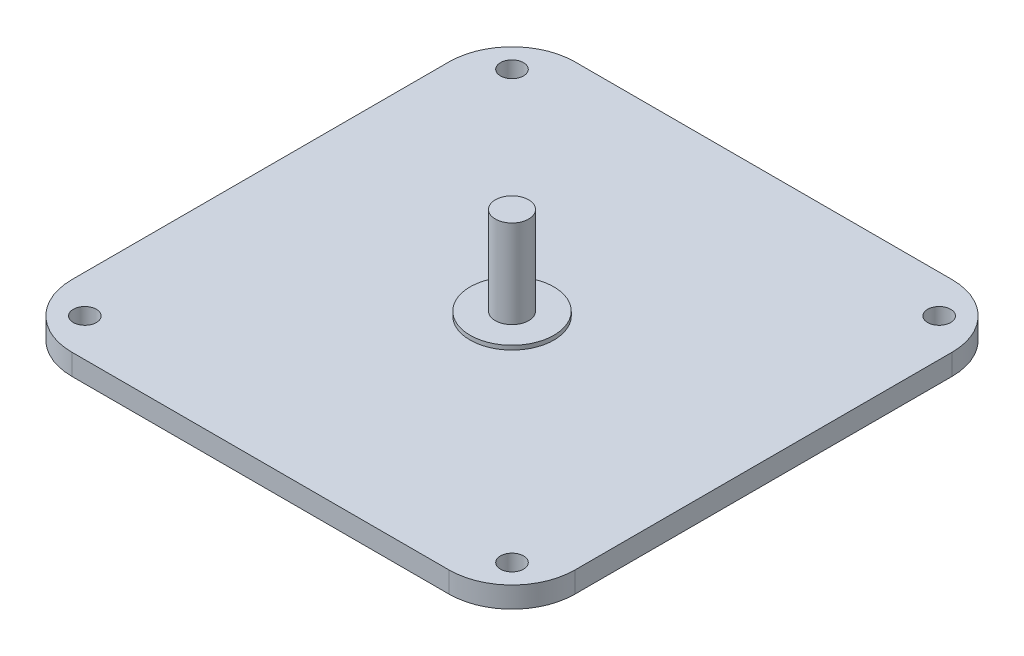
ISO-10303-21;
HEADER;
FILE_DESCRIPTION(('STEP AP214'),'2;1');
FILE_NAME('part.step','',(''),(''),'','','');
FILE_SCHEMA(('AUTOMOTIVE_DESIGN { 1 0 10303 214 1 1 1 1 }'));
ENDSEC;
DATA;
#1=APPLICATION_CONTEXT('core data for automotive mechanical design processes');
#2=APPLICATION_PROTOCOL_DEFINITION('international standard','automotive_design',2000,#1);
#3=PRODUCT_CONTEXT('',#1,'mechanical');
#4=PRODUCT('Part','Part','',(#3));
#5=PRODUCT_RELATED_PRODUCT_CATEGORY('part','',(#4));
#6=PRODUCT_DEFINITION_FORMATION('','',#4);
#7=PRODUCT_DEFINITION_CONTEXT('part definition',#1,'design');
#8=PRODUCT_DEFINITION('design','',#6,#7);
#9=PRODUCT_DEFINITION_SHAPE('','',#8);
#10=(LENGTH_UNIT() NAMED_UNIT(*) SI_UNIT(.MILLI.,.METRE.));
#11=(NAMED_UNIT(*) PLANE_ANGLE_UNIT() SI_UNIT($,.RADIAN.));
#12=(NAMED_UNIT(*) SI_UNIT($,.STERADIAN.) SOLID_ANGLE_UNIT());
#13=UNCERTAINTY_MEASURE_WITH_UNIT(LENGTH_MEASURE(1.E-05),#10,'distance_accuracy_value','');
#14=(GEOMETRIC_REPRESENTATION_CONTEXT(3) GLOBAL_UNCERTAINTY_ASSIGNED_CONTEXT((#13)) GLOBAL_UNIT_ASSIGNED_CONTEXT((#10,
#11,#12)) REPRESENTATION_CONTEXT('',''));
#15=CARTESIAN_POINT('',(0.,0.,0.));
#16=DIRECTION('',(0.,0.,1.));
#17=DIRECTION('',(1.,0.,0.));
#18=AXIS2_PLACEMENT_3D('',#15,#16,#17);
#19=CARTESIAN_POINT('',(0.,2.5,60.));
#20=DIRECTION('',(0.,0.,-1.));
#21=DIRECTION('',(-1.,0.,0.));
#22=AXIS2_PLACEMENT_3D('',#19,#20,#21);
#23=PLANE('',#22);
#24=DIRECTION('',(1.,0.,0.));
#25=VECTOR('',#24,1.);
#26=CARTESIAN_POINT('',(0.,-2.5,60.));
#27=LINE('',#26,#25);
#28=CARTESIAN_POINT('',(-45.,-2.5,60.));
#29=VERTEX_POINT('',#28);
#30=CARTESIAN_POINT('',(45.,-2.5,60.));
#31=VERTEX_POINT('',#30);
#32=EDGE_CURVE('E115',#29,#31,#27,.T.);
#33=ORIENTED_EDGE('',*,*,#32,.T.);
#34=DIRECTION('',(0.,-1.,0.));
#35=VECTOR('',#34,1.);
#36=CARTESIAN_POINT('',(45.,2.5,60.));
#37=LINE('',#36,#35);
#38=CARTESIAN_POINT('',(45.,2.5,60.));
#39=VERTEX_POINT('',#38);
#40=EDGE_CURVE('E11',#31,#39,#37,.F.);
#41=ORIENTED_EDGE('',*,*,#40,.T.);
#42=DIRECTION('',(1.,0.,0.));
#43=VECTOR('',#42,1.);
#44=CARTESIAN_POINT('',(0.,2.5,60.));
#45=LINE('',#44,#43);
#46=CARTESIAN_POINT('',(-45.,2.5,60.));
#47=VERTEX_POINT('',#46);
#48=EDGE_CURVE('E162',#47,#39,#45,.T.);
#49=ORIENTED_EDGE('',*,*,#48,.F.);
#50=DIRECTION('',(0.,-1.,0.));
#51=VECTOR('',#50,1.);
#52=CARTESIAN_POINT('',(-45.,-2.5,60.));
#53=LINE('',#52,#51);
#54=EDGE_CURVE('E47',#47,#29,#53,.T.);
#55=ORIENTED_EDGE('',*,*,#54,.T.);
#56=EDGE_LOOP('',(#33,#41,#49,#55));
#57=FACE_BOUND('',#56,.T.);
#58=ADVANCED_FACE('F37',(#57),#23,.F.);
#59=CARTESIAN_POINT('',(60.,2.5,0.));
#60=DIRECTION('',(-1.,0.,0.));
#61=DIRECTION('',(0.,0.,1.));
#62=AXIS2_PLACEMENT_3D('',#59,#60,#61);
#63=PLANE('',#62);
#64=DIRECTION('',(0.,0.,-1.));
#65=VECTOR('',#64,1.);
#66=CARTESIAN_POINT('',(60.,-2.5,0.));
#67=LINE('',#66,#65);
#68=CARTESIAN_POINT('',(60.,-2.5,45.));
#69=VERTEX_POINT('',#68);
#70=CARTESIAN_POINT('',(60.,-2.5,-45.));
#71=VERTEX_POINT('',#70);
#72=EDGE_CURVE('E189',#69,#71,#67,.T.);
#73=ORIENTED_EDGE('',*,*,#72,.T.);
#74=DIRECTION('',(0.,-1.,0.));
#75=VECTOR('',#74,1.);
#76=CARTESIAN_POINT('',(60.,2.5,-45.));
#77=LINE('',#76,#75);
#78=CARTESIAN_POINT('',(60.,2.5,-45.));
#79=VERTEX_POINT('',#78);
#80=EDGE_CURVE('E57',#71,#79,#77,.F.);
#81=ORIENTED_EDGE('',*,*,#80,.T.);
#82=DIRECTION('',(0.,0.,-1.));
#83=VECTOR('',#82,1.);
#84=CARTESIAN_POINT('',(60.,2.5,0.));
#85=LINE('',#84,#83);
#86=CARTESIAN_POINT('',(60.,2.5,45.));
#87=VERTEX_POINT('',#86);
#88=EDGE_CURVE('E161',#87,#79,#85,.T.);
#89=ORIENTED_EDGE('',*,*,#88,.F.);
#90=DIRECTION('',(0.,-1.,0.));
#91=VECTOR('',#90,1.);
#92=CARTESIAN_POINT('',(60.,2.5,45.));
#93=LINE('',#92,#91);
#94=EDGE_CURVE('E151',#87,#69,#93,.T.);
#95=ORIENTED_EDGE('',*,*,#94,.T.);
#96=EDGE_LOOP('',(#73,#81,#89,#95));
#97=FACE_BOUND('',#96,.T.);
#98=ADVANCED_FACE('F211',(#97),#63,.F.);
#99=CARTESIAN_POINT('',(0.,2.5,-60.));
#100=DIRECTION('',(0.,0.,-1.));
#101=DIRECTION('',(-1.,0.,0.));
#102=AXIS2_PLACEMENT_3D('',#99,#100,#101);
#103=PLANE('',#102);
#104=DIRECTION('',(1.,0.,0.));
#105=VECTOR('',#104,1.);
#106=CARTESIAN_POINT('',(0.,-2.5,-60.));
#107=LINE('',#106,#105);
#108=CARTESIAN_POINT('',(-45.,-2.5,-60.));
#109=VERTEX_POINT('',#108);
#110=CARTESIAN_POINT('',(45.,-2.5,-60.));
#111=VERTEX_POINT('',#110);
#112=EDGE_CURVE('E129',#109,#111,#107,.T.);
#113=ORIENTED_EDGE('',*,*,#112,.F.);
#114=DIRECTION('',(0.,-1.,0.));
#115=VECTOR('',#114,1.);
#116=CARTESIAN_POINT('',(-45.,2.5,-60.));
#117=LINE('',#116,#115);
#118=CARTESIAN_POINT('',(-45.,2.5,-60.));
#119=VERTEX_POINT('',#118);
#120=EDGE_CURVE('E150',#109,#119,#117,.F.);
#121=ORIENTED_EDGE('',*,*,#120,.T.);
#122=DIRECTION('',(1.,0.,0.));
#123=VECTOR('',#122,1.);
#124=CARTESIAN_POINT('',(0.,2.5,-60.));
#125=LINE('',#124,#123);
#126=CARTESIAN_POINT('',(45.,2.5,-60.));
#127=VERTEX_POINT('',#126);
#128=EDGE_CURVE('E131',#119,#127,#125,.T.);
#129=ORIENTED_EDGE('',*,*,#128,.T.);
#130=DIRECTION('',(0.,-1.,0.));
#131=VECTOR('',#130,1.);
#132=CARTESIAN_POINT('',(45.,-2.5,-60.));
#133=LINE('',#132,#131);
#134=EDGE_CURVE('E144',#127,#111,#133,.T.);
#135=ORIENTED_EDGE('',*,*,#134,.T.);
#136=EDGE_LOOP('',(#113,#121,#129,#135));
#137=FACE_BOUND('',#136,.T.);
#138=ADVANCED_FACE('F191',(#137),#103,.T.);
#139=CARTESIAN_POINT('',(50.9553953974915,2.5,50.9553953974922));
#140=DIRECTION('',(0.,-1.,0.));
#141=DIRECTION('',(0.,0.,-1.));
#142=AXIS2_PLACEMENT_3D('',#139,#140,#141);
#143=CYLINDRICAL_SURFACE('',#142,2.75);
#144=CARTESIAN_POINT('',(50.9553953974915,2.5,50.9553953974922));
#145=DIRECTION('',(0.,1.,0.));
#146=DIRECTION('',(0.,0.,1.));
#147=AXIS2_PLACEMENT_3D('',#144,#145,#146);
#148=CIRCLE('',#147,2.75);
#149=CARTESIAN_POINT('',(50.9553953974915,2.5,53.7053953974923));
#150=VERTEX_POINT('',#149);
#151=EDGE_CURVE('E165',#150,#150,#148,.T.);
#152=ORIENTED_EDGE('',*,*,#151,.T.);
#153=EDGE_LOOP('',(#152));
#154=FACE_BOUND('',#153,.T.);
#155=CARTESIAN_POINT('',(50.9553953974915,-2.5,50.9553953974922));
#156=DIRECTION('',(0.,1.,0.));
#157=DIRECTION('',(0.,0.,1.));
#158=AXIS2_PLACEMENT_3D('',#155,#156,#157);
#159=CIRCLE('',#158,2.75);
#160=CARTESIAN_POINT('',(50.9553953974915,-2.5,53.7053953974923));
#161=VERTEX_POINT('',#160);
#162=EDGE_CURVE('E183',#161,#161,#159,.T.);
#163=ORIENTED_EDGE('',*,*,#162,.F.);
#164=EDGE_LOOP('',(#163));
#165=FACE_BOUND('',#164,.T.);
#166=ADVANCED_FACE('F224',(#154,#165),#143,.F.);
#167=CARTESIAN_POINT('',(50.9553953974921,2.5,-50.9553953974917));
#168=DIRECTION('',(0.,-1.,0.));
#169=DIRECTION('',(0.,0.,-1.));
#170=AXIS2_PLACEMENT_3D('',#167,#168,#169);
#171=CYLINDRICAL_SURFACE('',#170,2.75);
#172=CARTESIAN_POINT('',(50.9553953974921,2.5,-50.9553953974917));
#173=DIRECTION('',(0.,1.,0.));
#174=DIRECTION('',(0.,0.,1.));
#175=AXIS2_PLACEMENT_3D('',#172,#173,#174);
#176=CIRCLE('',#175,2.75);
#177=CARTESIAN_POINT('',(50.9553953974921,2.5,-48.2053953974917));
#178=VERTEX_POINT('',#177);
#179=EDGE_CURVE('E166',#178,#178,#176,.T.);
#180=ORIENTED_EDGE('',*,*,#179,.T.);
#181=EDGE_LOOP('',(#180));
#182=FACE_BOUND('',#181,.T.);
#183=CARTESIAN_POINT('',(50.9553953974921,-2.5,-50.9553953974917));
#184=DIRECTION('',(0.,1.,0.));
#185=DIRECTION('',(0.,0.,1.));
#186=AXIS2_PLACEMENT_3D('',#183,#184,#185);
#187=CIRCLE('',#186,2.75);
#188=CARTESIAN_POINT('',(50.9553953974921,-2.5,-48.2053953974917));
#189=VERTEX_POINT('',#188);
#190=EDGE_CURVE('E181',#189,#189,#187,.T.);
#191=ORIENTED_EDGE('',*,*,#190,.F.);
#192=EDGE_LOOP('',(#191));
#193=FACE_BOUND('',#192,.T.);
#194=ADVANCED_FACE('F228',(#182,#193),#171,.F.);
#195=CARTESIAN_POINT('',(-50.9553953974919,2.5,-50.9553953974919));
#196=DIRECTION('',(0.,-1.,0.));
#197=DIRECTION('',(0.,0.,-1.));
#198=AXIS2_PLACEMENT_3D('',#195,#196,#197);
#199=CYLINDRICAL_SURFACE('',#198,2.75);
#200=CARTESIAN_POINT('',(-50.9553953974919,2.5,-50.9553953974919));
#201=DIRECTION('',(0.,1.,0.));
#202=DIRECTION('',(0.,0.,1.));
#203=AXIS2_PLACEMENT_3D('',#200,#201,#202);
#204=CIRCLE('',#203,2.75);
#205=CARTESIAN_POINT('',(-50.9553953974919,2.5,-48.2053953974919));
#206=VERTEX_POINT('',#205);
#207=EDGE_CURVE('E368',#206,#206,#204,.T.);
#208=ORIENTED_EDGE('',*,*,#207,.T.);
#209=EDGE_LOOP('',(#208));
#210=FACE_BOUND('',#209,.T.);
#211=CARTESIAN_POINT('',(-50.9553953974919,-2.5,-50.9553953974919));
#212=DIRECTION('',(0.,1.,0.));
#213=DIRECTION('',(0.,0.,1.));
#214=AXIS2_PLACEMENT_3D('',#211,#212,#213);
#215=CIRCLE('',#214,2.75);
#216=CARTESIAN_POINT('',(-50.9553953974919,-2.5,-48.2053953974919));
#217=VERTEX_POINT('',#216);
#218=EDGE_CURVE('E180',#217,#217,#215,.T.);
#219=ORIENTED_EDGE('',*,*,#218,.F.);
#220=EDGE_LOOP('',(#219));
#221=FACE_BOUND('',#220,.T.);
#222=ADVANCED_FACE('F229',(#210,#221),#199,.F.);
#223=CARTESIAN_POINT('',(-50.9553953974924,2.5,50.9553953974913));
#224=DIRECTION('',(0.,-1.,0.));
#225=DIRECTION('',(0.,0.,-1.));
#226=AXIS2_PLACEMENT_3D('',#223,#224,#225);
#227=CYLINDRICAL_SURFACE('',#226,2.75000000000001);
#228=CARTESIAN_POINT('',(-50.9553953974924,2.5,50.9553953974913));
#229=DIRECTION('',(0.,1.,0.));
#230=DIRECTION('',(0.,0.,1.));
#231=AXIS2_PLACEMENT_3D('',#228,#229,#230);
#232=CIRCLE('',#231,2.75000000000001);
#233=CARTESIAN_POINT('',(-50.9553953974924,2.5,53.7053953974914));
#234=VERTEX_POINT('',#233);
#235=EDGE_CURVE('E130',#234,#234,#232,.T.);
#236=ORIENTED_EDGE('',*,*,#235,.T.);
#237=EDGE_LOOP('',(#236));
#238=FACE_BOUND('',#237,.T.);
#239=CARTESIAN_POINT('',(-50.9553953974924,-2.5,50.9553953974913));
#240=DIRECTION('',(0.,1.,0.));
#241=DIRECTION('',(0.,0.,1.));
#242=AXIS2_PLACEMENT_3D('',#239,#240,#241);
#243=CIRCLE('',#242,2.75000000000001);
#244=CARTESIAN_POINT('',(-50.9553953974924,-2.5,53.7053953974914));
#245=VERTEX_POINT('',#244);
#246=EDGE_CURVE('E172',#245,#245,#243,.T.);
#247=ORIENTED_EDGE('',*,*,#246,.F.);
#248=EDGE_LOOP('',(#247));
#249=FACE_BOUND('',#248,.T.);
#250=ADVANCED_FACE('F234',(#238,#249),#227,.F.);
#251=CARTESIAN_POINT('',(-60.,2.5,0.));
#252=DIRECTION('',(-1.,0.,0.));
#253=DIRECTION('',(0.,0.,1.));
#254=AXIS2_PLACEMENT_3D('',#251,#252,#253);
#255=PLANE('',#254);
#256=DIRECTION('',(0.,0.,-1.));
#257=VECTOR('',#256,1.);
#258=CARTESIAN_POINT('',(-60.,2.5,0.));
#259=LINE('',#258,#257);
#260=CARTESIAN_POINT('',(-60.,2.5,45.));
#261=VERTEX_POINT('',#260);
#262=CARTESIAN_POINT('',(-60.,2.5,-45.));
#263=VERTEX_POINT('',#262);
#264=EDGE_CURVE('E135',#261,#263,#259,.T.);
#265=ORIENTED_EDGE('',*,*,#264,.T.);
#266=DIRECTION('',(0.,-1.,0.));
#267=VECTOR('',#266,1.);
#268=CARTESIAN_POINT('',(-60.,2.5,-45.));
#269=LINE('',#268,#267);
#270=CARTESIAN_POINT('',(-60.,-2.5,-45.));
#271=VERTEX_POINT('',#270);
#272=EDGE_CURVE('E117',#263,#271,#269,.T.);
#273=ORIENTED_EDGE('',*,*,#272,.T.);
#274=DIRECTION('',(0.,0.,-1.));
#275=VECTOR('',#274,1.);
#276=CARTESIAN_POINT('',(-60.,-2.5,0.));
#277=LINE('',#276,#275);
#278=CARTESIAN_POINT('',(-60.,-2.5,45.));
#279=VERTEX_POINT('',#278);
#280=EDGE_CURVE('E109',#279,#271,#277,.T.);
#281=ORIENTED_EDGE('',*,*,#280,.F.);
#282=DIRECTION('',(0.,-1.,0.));
#283=VECTOR('',#282,1.);
#284=CARTESIAN_POINT('',(-60.,2.5,45.));
#285=LINE('',#284,#283);
#286=EDGE_CURVE('E121',#279,#261,#285,.F.);
#287=ORIENTED_EDGE('',*,*,#286,.T.);
#288=EDGE_LOOP('',(#265,#273,#281,#287));
#289=FACE_BOUND('',#288,.T.);
#290=ADVANCED_FACE('F124',(#289),#255,.T.);
#291=CARTESIAN_POINT('',(0.,2.5,0.));
#292=DIRECTION('',(0.,1.,0.));
#293=DIRECTION('',(0.,0.,1.));
#294=AXIS2_PLACEMENT_3D('',#291,#292,#293);
#295=PLANE('',#294);
#296=CARTESIAN_POINT('',(0.,2.5,0.));
#297=DIRECTION('',(0.,1.,0.));
#298=DIRECTION('',(0.,0.,1.));
#299=AXIS2_PLACEMENT_3D('',#296,#297,#298);
#300=CIRCLE('',#299,10.);
#301=CARTESIAN_POINT('',(0.,2.5,10.));
#302=VERTEX_POINT('',#301);
#303=EDGE_CURVE('E359',#302,#302,#300,.T.);
#304=ORIENTED_EDGE('',*,*,#303,.F.);
#305=EDGE_LOOP('',(#304));
#306=FACE_BOUND('',#305,.T.);
#307=ORIENTED_EDGE('',*,*,#235,.F.);
#308=EDGE_LOOP('',(#307));
#309=FACE_BOUND('',#308,.T.);
#310=ORIENTED_EDGE('',*,*,#207,.F.);
#311=EDGE_LOOP('',(#310));
#312=FACE_BOUND('',#311,.T.);
#313=ORIENTED_EDGE('',*,*,#179,.F.);
#314=EDGE_LOOP('',(#313));
#315=FACE_BOUND('',#314,.T.);
#316=ORIENTED_EDGE('',*,*,#151,.F.);
#317=EDGE_LOOP('',(#316));
#318=FACE_BOUND('',#317,.T.);
#319=ORIENTED_EDGE('',*,*,#128,.F.);
#320=CARTESIAN_POINT('',(-45.,2.5,-45.));
#321=DIRECTION('',(0.,1.,0.));
#322=DIRECTION('',(0.,0.,1.));
#323=AXIS2_PLACEMENT_3D('',#320,#321,#322);
#324=CIRCLE('',#323,15.);
#325=EDGE_CURVE('E153',#119,#263,#324,.T.);
#326=ORIENTED_EDGE('',*,*,#325,.T.);
#327=ORIENTED_EDGE('',*,*,#264,.F.);
#328=CARTESIAN_POINT('',(-45.,2.5,45.));
#329=DIRECTION('',(0.,1.,0.));
#330=DIRECTION('',(0.,0.,1.));
#331=AXIS2_PLACEMENT_3D('',#328,#329,#330);
#332=CIRCLE('',#331,15.);
#333=EDGE_CURVE('E132',#261,#47,#332,.T.);
#334=ORIENTED_EDGE('',*,*,#333,.T.);
#335=ORIENTED_EDGE('',*,*,#48,.T.);
#336=CARTESIAN_POINT('',(45.,2.5,45.));
#337=DIRECTION('',(0.,1.,0.));
#338=DIRECTION('',(0.,0.,1.));
#339=AXIS2_PLACEMENT_3D('',#336,#337,#338);
#340=CIRCLE('',#339,15.);
#341=EDGE_CURVE('E64',#39,#87,#340,.T.);
#342=ORIENTED_EDGE('',*,*,#341,.T.);
#343=ORIENTED_EDGE('',*,*,#88,.T.);
#344=CARTESIAN_POINT('',(45.,2.5,-45.));
#345=DIRECTION('',(0.,1.,0.));
#346=DIRECTION('',(0.,0.,1.));
#347=AXIS2_PLACEMENT_3D('',#344,#345,#346);
#348=CIRCLE('',#347,15.);
#349=EDGE_CURVE('E152',#79,#127,#348,.T.);
#350=ORIENTED_EDGE('',*,*,#349,.T.);
#351=EDGE_LOOP('',(#319,#326,#327,#334,#335,#342,#343,#350));
#352=FACE_BOUND('',#351,.T.);
#353=ADVANCED_FACE('F196',(#306,#309,#312,#315,#318,#352),#295,.T.);
#354=CARTESIAN_POINT('',(0.,-2.5,0.));
#355=DIRECTION('',(0.,1.,0.));
#356=DIRECTION('',(0.,0.,1.));
#357=AXIS2_PLACEMENT_3D('',#354,#355,#356);
#358=PLANE('',#357);
#359=ORIENTED_EDGE('',*,*,#246,.T.);
#360=EDGE_LOOP('',(#359));
#361=FACE_BOUND('',#360,.T.);
#362=ORIENTED_EDGE('',*,*,#218,.T.);
#363=EDGE_LOOP('',(#362));
#364=FACE_BOUND('',#363,.T.);
#365=ORIENTED_EDGE('',*,*,#190,.T.);
#366=EDGE_LOOP('',(#365));
#367=FACE_BOUND('',#366,.T.);
#368=ORIENTED_EDGE('',*,*,#162,.T.);
#369=EDGE_LOOP('',(#368));
#370=FACE_BOUND('',#369,.T.);
#371=ORIENTED_EDGE('',*,*,#280,.T.);
#372=CARTESIAN_POINT('',(-45.,-2.5,-45.));
#373=DIRECTION('',(0.,1.,0.));
#374=DIRECTION('',(0.,0.,1.));
#375=AXIS2_PLACEMENT_3D('',#372,#373,#374);
#376=CIRCLE('',#375,15.);
#377=EDGE_CURVE('E145',#271,#109,#376,.F.);
#378=ORIENTED_EDGE('',*,*,#377,.T.);
#379=ORIENTED_EDGE('',*,*,#112,.T.);
#380=CARTESIAN_POINT('',(45.,-2.5,-45.));
#381=DIRECTION('',(0.,1.,0.));
#382=DIRECTION('',(0.,0.,1.));
#383=AXIS2_PLACEMENT_3D('',#380,#381,#382);
#384=CIRCLE('',#383,15.);
#385=EDGE_CURVE('E140',#111,#71,#384,.F.);
#386=ORIENTED_EDGE('',*,*,#385,.T.);
#387=ORIENTED_EDGE('',*,*,#72,.F.);
#388=CARTESIAN_POINT('',(45.,-2.5,45.));
#389=DIRECTION('',(0.,1.,0.));
#390=DIRECTION('',(0.,0.,1.));
#391=AXIS2_PLACEMENT_3D('',#388,#389,#390);
#392=CIRCLE('',#391,15.);
#393=EDGE_CURVE('E120',#69,#31,#392,.F.);
#394=ORIENTED_EDGE('',*,*,#393,.T.);
#395=ORIENTED_EDGE('',*,*,#32,.F.);
#396=CARTESIAN_POINT('',(-45.,-2.5,45.));
#397=DIRECTION('',(0.,1.,0.));
#398=DIRECTION('',(0.,0.,1.));
#399=AXIS2_PLACEMENT_3D('',#396,#397,#398);
#400=CIRCLE('',#399,15.);
#401=EDGE_CURVE('E110',#29,#279,#400,.F.);
#402=ORIENTED_EDGE('',*,*,#401,.T.);
#403=EDGE_LOOP('',(#371,#378,#379,#386,#387,#394,#395,#402));
#404=FACE_BOUND('',#403,.T.);
#405=ADVANCED_FACE('F107',(#361,#364,#367,#370,#404),#358,.F.);
#406=CARTESIAN_POINT('',(-45.,2.5,-45.));
#407=DIRECTION('',(0.,-1.,0.));
#408=DIRECTION('',(0.,0.,-1.));
#409=AXIS2_PLACEMENT_3D('',#406,#407,#408);
#410=CYLINDRICAL_SURFACE('',#409,15.);
#411=ORIENTED_EDGE('',*,*,#325,.F.);
#412=ORIENTED_EDGE('',*,*,#120,.F.);
#413=ORIENTED_EDGE('',*,*,#377,.F.);
#414=ORIENTED_EDGE('',*,*,#272,.F.);
#415=EDGE_LOOP('',(#411,#412,#413,#414));
#416=FACE_BOUND('',#415,.T.);
#417=ADVANCED_FACE('F199',(#416),#410,.T.);
#418=CARTESIAN_POINT('',(45.,2.5,-45.));
#419=DIRECTION('',(0.,1.,0.));
#420=DIRECTION('',(0.,0.,1.));
#421=AXIS2_PLACEMENT_3D('',#418,#419,#420);
#422=CYLINDRICAL_SURFACE('',#421,15.);
#423=ORIENTED_EDGE('',*,*,#349,.F.);
#424=ORIENTED_EDGE('',*,*,#80,.F.);
#425=ORIENTED_EDGE('',*,*,#385,.F.);
#426=ORIENTED_EDGE('',*,*,#134,.F.);
#427=EDGE_LOOP('',(#423,#424,#425,#426));
#428=FACE_BOUND('',#427,.T.);
#429=ADVANCED_FACE('F204',(#428),#422,.T.);
#430=CARTESIAN_POINT('',(45.,2.5,45.));
#431=DIRECTION('',(0.,-1.,0.));
#432=DIRECTION('',(0.,0.,-1.));
#433=AXIS2_PLACEMENT_3D('',#430,#431,#432);
#434=CYLINDRICAL_SURFACE('',#433,15.);
#435=ORIENTED_EDGE('',*,*,#341,.F.);
#436=ORIENTED_EDGE('',*,*,#40,.F.);
#437=ORIENTED_EDGE('',*,*,#393,.F.);
#438=ORIENTED_EDGE('',*,*,#94,.F.);
#439=EDGE_LOOP('',(#435,#436,#437,#438));
#440=FACE_BOUND('',#439,.T.);
#441=ADVANCED_FACE('F205',(#440),#434,.T.);
#442=CARTESIAN_POINT('',(-45.,2.5,45.));
#443=DIRECTION('',(0.,1.,0.));
#444=DIRECTION('',(0.,0.,1.));
#445=AXIS2_PLACEMENT_3D('',#442,#443,#444);
#446=CYLINDRICAL_SURFACE('',#445,15.);
#447=ORIENTED_EDGE('',*,*,#333,.F.);
#448=ORIENTED_EDGE('',*,*,#286,.F.);
#449=ORIENTED_EDGE('',*,*,#401,.F.);
#450=ORIENTED_EDGE('',*,*,#54,.F.);
#451=EDGE_LOOP('',(#447,#448,#449,#450));
#452=FACE_BOUND('',#451,.T.);
#453=ADVANCED_FACE('F45',(#452),#446,.T.);
#454=CARTESIAN_POINT('',(0.,3.5,0.));
#455=DIRECTION('',(0.,-1.,0.));
#456=DIRECTION('',(0.,0.,-1.));
#457=AXIS2_PLACEMENT_3D('',#454,#455,#456);
#458=CYLINDRICAL_SURFACE('',#457,10.);
#459=CARTESIAN_POINT('',(0.,3.5,0.));
#460=DIRECTION('',(0.,1.,0.));
#461=DIRECTION('',(0.,0.,1.));
#462=AXIS2_PLACEMENT_3D('',#459,#460,#461);
#463=CIRCLE('',#462,10.);
#464=CARTESIAN_POINT('',(0.,3.5,10.));
#465=VERTEX_POINT('',#464);
#466=EDGE_CURVE('E360',#465,#465,#463,.T.);
#467=ORIENTED_EDGE('',*,*,#466,.F.);
#468=EDGE_LOOP('',(#467));
#469=FACE_BOUND('',#468,.T.);
#470=ORIENTED_EDGE('',*,*,#303,.T.);
#471=EDGE_LOOP('',(#470));
#472=FACE_BOUND('',#471,.T.);
#473=ADVANCED_FACE('F317',(#469,#472),#458,.T.);
#474=CARTESIAN_POINT('',(0.,3.5,0.));
#475=DIRECTION('',(0.,1.,0.));
#476=DIRECTION('',(0.,0.,1.));
#477=AXIS2_PLACEMENT_3D('',#474,#475,#476);
#478=PLANE('',#477);
#479=CARTESIAN_POINT('',(0.,3.5,0.));
#480=DIRECTION('',(0.,1.,0.));
#481=DIRECTION('',(0.,0.,1.));
#482=AXIS2_PLACEMENT_3D('',#479,#480,#481);
#483=CIRCLE('',#482,3.975);
#484=CARTESIAN_POINT('',(0.,3.5,3.975));
#485=VERTEX_POINT('',#484);
#486=EDGE_CURVE('E42',#485,#485,#483,.T.);
#487=ORIENTED_EDGE('',*,*,#486,.F.);
#488=EDGE_LOOP('',(#487));
#489=FACE_BOUND('',#488,.T.);
#490=ORIENTED_EDGE('',*,*,#466,.T.);
#491=EDGE_LOOP('',(#490));
#492=FACE_BOUND('',#491,.T.);
#493=ADVANCED_FACE('F333',(#489,#492),#478,.T.);
#494=CARTESIAN_POINT('',(0.,24.5,0.));
#495=DIRECTION('',(0.,1.,0.));
#496=DIRECTION('',(0.,0.,1.));
#497=AXIS2_PLACEMENT_3D('',#494,#495,#496);
#498=PLANE('',#497);
#499=CARTESIAN_POINT('',(0.,24.5,0.));
#500=DIRECTION('',(0.,1.,0.));
#501=DIRECTION('',(0.,0.,1.));
#502=AXIS2_PLACEMENT_3D('',#499,#500,#501);
#503=CIRCLE('',#502,3.975);
#504=CARTESIAN_POINT('',(0.,24.5,3.975));
#505=VERTEX_POINT('',#504);
#506=EDGE_CURVE('E178',#505,#505,#503,.T.);
#507=ORIENTED_EDGE('',*,*,#506,.T.);
#508=EDGE_LOOP('',(#507));
#509=FACE_BOUND('',#508,.T.);
#510=ADVANCED_FACE('F323',(#509),#498,.T.);
#511=CARTESIAN_POINT('',(0.,24.5,0.));
#512=DIRECTION('',(0.,-1.,0.));
#513=DIRECTION('',(0.,0.,-1.));
#514=AXIS2_PLACEMENT_3D('',#511,#512,#513);
#515=CYLINDRICAL_SURFACE('',#514,3.975);
#516=ORIENTED_EDGE('',*,*,#486,.T.);
#517=EDGE_LOOP('',(#516));
#518=FACE_BOUND('',#517,.T.);
#519=ORIENTED_EDGE('',*,*,#506,.F.);
#520=EDGE_LOOP('',(#519));
#521=FACE_BOUND('',#520,.T.);
#522=ADVANCED_FACE('F318',(#518,#521),#515,.T.);
#523=CLOSED_SHELL('',(#58,#98,#138,#166,#194,#222,#250,#290,#353,#405,#417,#429,#441,#453,#473,
#493,#510,#522));
#524=MANIFOLD_SOLID_BREP('B2',#523);
#525=ADVANCED_BREP_SHAPE_REPRESENTATION('',(#18,#524),#14);
#526=SHAPE_DEFINITION_REPRESENTATION(#9,#525);
ENDSEC;
END-ISO-10303-21;
